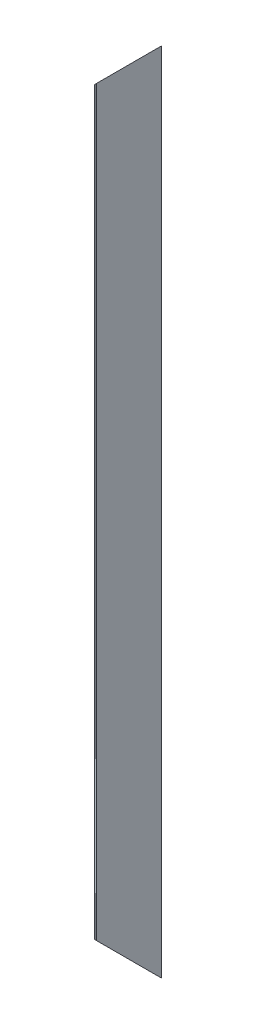
ISO-10303-21;
HEADER;
FILE_DESCRIPTION(('STEP AP214'),'2;1');
FILE_NAME('part.step','',(''),(''),'','','');
FILE_SCHEMA(('AUTOMOTIVE_DESIGN { 1 0 10303 214 1 1 1 1 }'));
ENDSEC;
DATA;
#1=APPLICATION_CONTEXT('core data for automotive mechanical design processes');
#2=APPLICATION_PROTOCOL_DEFINITION('international standard','automotive_design',2000,#1);
#3=PRODUCT_CONTEXT('',#1,'mechanical');
#4=PRODUCT('Part','Part','',(#3));
#5=PRODUCT_RELATED_PRODUCT_CATEGORY('part','',(#4));
#6=PRODUCT_DEFINITION_FORMATION('','',#4);
#7=PRODUCT_DEFINITION_CONTEXT('part definition',#1,'design');
#8=PRODUCT_DEFINITION('design','',#6,#7);
#9=PRODUCT_DEFINITION_SHAPE('','',#8);
#10=(LENGTH_UNIT() NAMED_UNIT(*) SI_UNIT(.MILLI.,.METRE.));
#11=(NAMED_UNIT(*) PLANE_ANGLE_UNIT() SI_UNIT($,.RADIAN.));
#12=(NAMED_UNIT(*) SI_UNIT($,.STERADIAN.) SOLID_ANGLE_UNIT());
#13=UNCERTAINTY_MEASURE_WITH_UNIT(LENGTH_MEASURE(1.E-05),#10,'distance_accuracy_value','');
#14=(GEOMETRIC_REPRESENTATION_CONTEXT(3) GLOBAL_UNCERTAINTY_ASSIGNED_CONTEXT((#13)) GLOBAL_UNIT_ASSIGNED_CONTEXT((#10,
#11,#12)) REPRESENTATION_CONTEXT('',''));
#15=CARTESIAN_POINT('',(0.,0.,0.));
#16=DIRECTION('',(0.,0.,1.));
#17=DIRECTION('',(1.,0.,0.));
#18=AXIS2_PLACEMENT_3D('',#15,#16,#17);
#19=CARTESIAN_POINT('',(-250.,250.,40.));
#20=DIRECTION('',(-0.707106781186547,0.707106781186548,0.));
#21=DIRECTION('',(-0.707106781186548,-0.707106781186547,0.));
#22=AXIS2_PLACEMENT_3D('',#19,#20,#21);
#23=PLANE('',#22);
#24=DIRECTION('',(0.,0.,-1.));
#25=VECTOR('',#24,1.);
#26=CARTESIAN_POINT('',(-18.5857864376268,481.414213562373,3.));
#27=LINE('',#26,#25);
#28=CARTESIAN_POINT('',(-18.5857864376268,481.414213562373,3.));
#29=VERTEX_POINT('',#28);
#30=CARTESIAN_POINT('',(-18.5857864376268,481.414213562373,0.));
#31=VERTEX_POINT('',#30);
#32=EDGE_CURVE('E13',#29,#31,#27,.T.);
#33=ORIENTED_EDGE('',*,*,#32,.F.);
#34=DIRECTION('',(0.707106781186548,0.707106781186547,0.));
#35=VECTOR('',#34,1.);
#36=CARTESIAN_POINT('',(-4.5,495.5,3.));
#37=LINE('',#36,#35);
#38=CARTESIAN_POINT('',(-9.,491.,3.));
#39=VERTEX_POINT('',#38);
#40=EDGE_CURVE('E169',#29,#39,#37,.T.);
#41=ORIENTED_EDGE('',*,*,#40,.T.);
#42=CARTESIAN_POINT('',(-9.,491.,9.));
#43=DIRECTION('',(-0.707106781186547,0.707106781186548,0.));
#44=DIRECTION('',(-0.707106781186548,-0.707106781186547,0.));
#45=AXIS2_PLACEMENT_3D('',#42,#43,#44);
#46=ELLIPSE('',#45,8.48528137423857,6.);
#47=CARTESIAN_POINT('',(-3.,497.,9.));
#48=VERTEX_POINT('',#47);
#49=EDGE_CURVE('E166',#39,#48,#46,.F.);
#50=ORIENTED_EDGE('',*,*,#49,.T.);
#51=DIRECTION('',(0.,0.,1.));
#52=VECTOR('',#51,1.);
#53=CARTESIAN_POINT('',(-3.,497.,37.));
#54=LINE('',#53,#52);
#55=CARTESIAN_POINT('',(-3.,497.,37.));
#56=VERTEX_POINT('',#55);
#57=EDGE_CURVE('E163',#48,#56,#54,.T.);
#58=ORIENTED_EDGE('',*,*,#57,.T.);
#59=CARTESIAN_POINT('',(0.,500.,37.));
#60=DIRECTION('',(-0.707106781186547,0.707106781186548,0.));
#61=DIRECTION('',(-0.707106781186548,-0.707106781186547,0.));
#62=AXIS2_PLACEMENT_3D('',#59,#60,#61);
#63=ELLIPSE('',#62,4.24264068711929,3.);
#64=CARTESIAN_POINT('',(0.,500.,40.));
#65=VERTEX_POINT('',#64);
#66=EDGE_CURVE('E88',#56,#65,#63,.T.);
#67=ORIENTED_EDGE('',*,*,#66,.T.);
#68=DIRECTION('',(0.,0.,-1.));
#69=VECTOR('',#68,1.);
#70=CARTESIAN_POINT('',(0.,500.,40.));
#71=LINE('',#70,#69);
#72=CARTESIAN_POINT('',(0.,500.,0.));
#73=VERTEX_POINT('',#72);
#74=EDGE_CURVE('E149',#65,#73,#71,.T.);
#75=ORIENTED_EDGE('',*,*,#74,.T.);
#76=DIRECTION('',(0.707106781186548,0.707106781186547,0.));
#77=VECTOR('',#76,1.);
#78=CARTESIAN_POINT('',(-250.,250.,0.));
#79=LINE('',#78,#77);
#80=EDGE_CURVE('E142',#31,#73,#79,.T.);
#81=ORIENTED_EDGE('',*,*,#80,.F.);
#82=EDGE_LOOP('',(#33,#41,#50,#58,#67,#75,#81));
#83=FACE_BOUND('',#82,.T.);
#84=ADVANCED_FACE('F64',(#83),#23,.T.);
#85=CARTESIAN_POINT('',(-40.,500.,0.));
#86=DIRECTION('',(0.,0.,1.));
#87=DIRECTION('',(1.,0.,0.));
#88=AXIS2_PLACEMENT_3D('',#85,#86,#87);
#89=PLANE('',#88);
#90=CARTESIAN_POINT('',(-20.,20.,0.));
#91=DIRECTION('',(0.,0.,-1.));
#92=DIRECTION('',(-1.,0.,0.));
#93=AXIS2_PLACEMENT_3D('',#90,#91,#92);
#94=CIRCLE('',#93,2.);
#95=CARTESIAN_POINT('',(-22.,20.,0.));
#96=VERTEX_POINT('',#95);
#97=EDGE_CURVE('E236',#96,#96,#94,.T.);
#98=ORIENTED_EDGE('',*,*,#97,.F.);
#99=EDGE_LOOP('',(#98));
#100=FACE_BOUND('',#99,.T.);
#101=CARTESIAN_POINT('',(-40.,460.,0.));
#102=VERTEX_POINT('',#101);
#103=CARTESIAN_POINT('',(-21.414213562373,478.585786437627,0.));
#104=VERTEX_POINT('',#103);
#105=EDGE_CURVE('E144',#102,#104,#79,.T.);
#106=ORIENTED_EDGE('',*,*,#105,.T.);
#107=CARTESIAN_POINT('',(-20.,480.,0.));
#108=DIRECTION('',(0.,0.,-1.));
#109=DIRECTION('',(-1.,0.,0.));
#110=AXIS2_PLACEMENT_3D('',#107,#108,#109);
#111=CIRCLE('',#110,2.);
#112=EDGE_CURVE('E79',#31,#104,#111,.T.);
#113=ORIENTED_EDGE('',*,*,#112,.F.);
#114=ORIENTED_EDGE('',*,*,#80,.T.);
#115=DIRECTION('',(0.,-1.,0.));
#116=VECTOR('',#115,1.);
#117=CARTESIAN_POINT('',(0.,500.,0.));
#118=LINE('',#117,#116);
#119=CARTESIAN_POINT('',(0.,0.,0.));
#120=VERTEX_POINT('',#119);
#121=EDGE_CURVE('E180',#73,#120,#118,.T.);
#122=ORIENTED_EDGE('',*,*,#121,.T.);
#123=DIRECTION('',(-1.,0.,0.));
#124=VECTOR('',#123,1.);
#125=CARTESIAN_POINT('',(-40.,0.,0.));
#126=LINE('',#125,#124);
#127=CARTESIAN_POINT('',(-40.,0.,0.));
#128=VERTEX_POINT('',#127);
#129=EDGE_CURVE('E177',#120,#128,#126,.T.);
#130=ORIENTED_EDGE('',*,*,#129,.T.);
#131=DIRECTION('',(0.,-1.,0.));
#132=VECTOR('',#131,1.);
#133=CARTESIAN_POINT('',(-40.,500.,0.));
#134=LINE('',#133,#132);
#135=EDGE_CURVE('E206',#102,#128,#134,.T.);
#136=ORIENTED_EDGE('',*,*,#135,.F.);
#137=EDGE_LOOP('',(#106,#113,#114,#122,#130,#136));
#138=FACE_BOUND('',#137,.T.);
#139=ADVANCED_FACE('F66',(#100,#138),#89,.F.);
#140=CARTESIAN_POINT('',(-37.,500.,0.));
#141=DIRECTION('',(0.,-1.,0.));
#142=DIRECTION('',(0.,0.,-1.));
#143=AXIS2_PLACEMENT_3D('',#140,#141,#142);
#144=CYLINDRICAL_SURFACE('',#143,3.);
#145=ORIENTED_EDGE('',*,*,#135,.T.);
#146=CARTESIAN_POINT('',(-37.,0.,0.));
#147=DIRECTION('',(0.,0.707106781186548,-0.707106781186548));
#148=DIRECTION('',(0.,-0.707106781186548,-0.707106781186548));
#149=AXIS2_PLACEMENT_3D('',#146,#147,#148);
#150=ELLIPSE('',#149,4.24264068711928,3.);
#151=CARTESIAN_POINT('',(-37.,3.,3.));
#152=VERTEX_POINT('',#151);
#153=EDGE_CURVE('E152',#128,#152,#150,.T.);
#154=ORIENTED_EDGE('',*,*,#153,.T.);
#155=DIRECTION('',(0.,-1.,0.));
#156=VECTOR('',#155,1.);
#157=CARTESIAN_POINT('',(-37.,500.,3.));
#158=LINE('',#157,#156);
#159=CARTESIAN_POINT('',(-37.,463.,3.));
#160=VERTEX_POINT('',#159);
#161=EDGE_CURVE('E202',#160,#152,#158,.T.);
#162=ORIENTED_EDGE('',*,*,#161,.F.);
#163=CARTESIAN_POINT('',(-37.,463.,0.));
#164=DIRECTION('',(-0.707106781186547,0.707106781186548,0.));
#165=DIRECTION('',(-0.707106781186548,-0.707106781186547,0.));
#166=AXIS2_PLACEMENT_3D('',#163,#164,#165);
#167=ELLIPSE('',#166,4.24264068711928,3.);
#168=EDGE_CURVE('E174',#102,#160,#167,.T.);
#169=ORIENTED_EDGE('',*,*,#168,.F.);
#170=EDGE_LOOP('',(#145,#154,#162,#169));
#171=FACE_BOUND('',#170,.T.);
#172=ADVANCED_FACE('F222',(#171),#144,.T.);
#173=CARTESIAN_POINT('',(-9.,500.,3.));
#174=DIRECTION('',(0.,0.,-1.));
#175=DIRECTION('',(-1.,0.,0.));
#176=AXIS2_PLACEMENT_3D('',#173,#174,#175);
#177=PLANE('',#176);
#178=CARTESIAN_POINT('',(-20.,20.,3.));
#179=DIRECTION('',(0.,0.,-1.));
#180=DIRECTION('',(-1.,0.,0.));
#181=AXIS2_PLACEMENT_3D('',#178,#179,#180);
#182=CIRCLE('',#181,2.);
#183=CARTESIAN_POINT('',(-22.,20.,3.));
#184=VERTEX_POINT('',#183);
#185=EDGE_CURVE('E146',#184,#184,#182,.T.);
#186=ORIENTED_EDGE('',*,*,#185,.T.);
#187=EDGE_LOOP('',(#186));
#188=FACE_BOUND('',#187,.T.);
#189=ORIENTED_EDGE('',*,*,#40,.F.);
#190=CARTESIAN_POINT('',(-20.,480.,3.));
#191=DIRECTION('',(0.,0.,-1.));
#192=DIRECTION('',(-1.,0.,0.));
#193=AXIS2_PLACEMENT_3D('',#190,#191,#192);
#194=CIRCLE('',#193,2.);
#195=CARTESIAN_POINT('',(-21.414213562373,478.585786437627,3.));
#196=VERTEX_POINT('',#195);
#197=EDGE_CURVE('E136',#29,#196,#194,.T.);
#198=ORIENTED_EDGE('',*,*,#197,.T.);
#199=EDGE_CURVE('E170',#160,#196,#37,.T.);
#200=ORIENTED_EDGE('',*,*,#199,.F.);
#201=ORIENTED_EDGE('',*,*,#161,.T.);
#202=DIRECTION('',(1.,0.,0.));
#203=VECTOR('',#202,1.);
#204=CARTESIAN_POINT('',(-9.,3.,3.));
#205=LINE('',#204,#203);
#206=CARTESIAN_POINT('',(-9.,3.,3.));
#207=VERTEX_POINT('',#206);
#208=EDGE_CURVE('E157',#152,#207,#205,.T.);
#209=ORIENTED_EDGE('',*,*,#208,.T.);
#210=DIRECTION('',(0.,-1.,0.));
#211=VECTOR('',#210,1.);
#212=CARTESIAN_POINT('',(-9.,500.,3.));
#213=LINE('',#212,#211);
#214=EDGE_CURVE('E198',#39,#207,#213,.T.);
#215=ORIENTED_EDGE('',*,*,#214,.F.);
#216=EDGE_LOOP('',(#189,#198,#200,#201,#209,#215));
#217=FACE_BOUND('',#216,.T.);
#218=ADVANCED_FACE('F213',(#188,#217),#177,.F.);
#219=CARTESIAN_POINT('',(-9.,500.,9.));
#220=DIRECTION('',(0.,-1.,0.));
#221=DIRECTION('',(0.,0.,-1.));
#222=AXIS2_PLACEMENT_3D('',#219,#220,#221);
#223=CYLINDRICAL_SURFACE('',#222,6.);
#224=ORIENTED_EDGE('',*,*,#214,.T.);
#225=CARTESIAN_POINT('',(-9.,9.00000000000001,9.));
#226=DIRECTION('',(0.,0.707106781186548,-0.707106781186548));
#227=DIRECTION('',(0.,-0.707106781186548,-0.707106781186548));
#228=AXIS2_PLACEMENT_3D('',#225,#226,#227);
#229=ELLIPSE('',#228,8.48528137423857,6.);
#230=CARTESIAN_POINT('',(-3.,8.99999999999995,9.00000000000001));
#231=VERTEX_POINT('',#230);
#232=EDGE_CURVE('E242',#207,#231,#229,.F.);
#233=ORIENTED_EDGE('',*,*,#232,.T.);
#234=DIRECTION('',(0.,-1.,0.));
#235=VECTOR('',#234,1.);
#236=CARTESIAN_POINT('',(-3.,500.,9.));
#237=LINE('',#236,#235);
#238=EDGE_CURVE('E194',#48,#231,#237,.T.);
#239=ORIENTED_EDGE('',*,*,#238,.F.);
#240=ORIENTED_EDGE('',*,*,#49,.F.);
#241=EDGE_LOOP('',(#224,#233,#239,#240));
#242=FACE_BOUND('',#241,.T.);
#243=ADVANCED_FACE('F249',(#242),#223,.F.);
#244=CARTESIAN_POINT('',(-3.,500.,37.));
#245=DIRECTION('',(1.,0.,0.));
#246=DIRECTION('',(0.,0.,-1.));
#247=AXIS2_PLACEMENT_3D('',#244,#245,#246);
#248=PLANE('',#247);
#249=ORIENTED_EDGE('',*,*,#238,.T.);
#250=DIRECTION('',(0.,0.707106781186548,0.707106781186548));
#251=VECTOR('',#250,1.);
#252=CARTESIAN_POINT('',(-3.,268.5,268.5));
#253=LINE('',#252,#251);
#254=CARTESIAN_POINT('',(-3.,37.,37.));
#255=VERTEX_POINT('',#254);
#256=EDGE_CURVE('E233',#231,#255,#253,.T.);
#257=ORIENTED_EDGE('',*,*,#256,.T.);
#258=DIRECTION('',(0.,-1.,0.));
#259=VECTOR('',#258,1.);
#260=CARTESIAN_POINT('',(-3.,500.,37.));
#261=LINE('',#260,#259);
#262=EDGE_CURVE('E190',#56,#255,#261,.T.);
#263=ORIENTED_EDGE('',*,*,#262,.F.);
#264=ORIENTED_EDGE('',*,*,#57,.F.);
#265=EDGE_LOOP('',(#249,#257,#263,#264));
#266=FACE_BOUND('',#265,.T.);
#267=ADVANCED_FACE('F254',(#266),#248,.F.);
#268=CARTESIAN_POINT('',(0.,500.,37.));
#269=DIRECTION('',(0.,-1.,0.));
#270=DIRECTION('',(0.,0.,-1.));
#271=AXIS2_PLACEMENT_3D('',#268,#269,#270);
#272=CYLINDRICAL_SURFACE('',#271,3.);
#273=ORIENTED_EDGE('',*,*,#262,.T.);
#274=CARTESIAN_POINT('',(0.,37.,37.));
#275=DIRECTION('',(0.,0.707106781186548,-0.707106781186548));
#276=DIRECTION('',(0.,-0.707106781186548,-0.707106781186548));
#277=AXIS2_PLACEMENT_3D('',#274,#275,#276);
#278=ELLIPSE('',#277,4.24264068711929,3.);
#279=CARTESIAN_POINT('',(0.,40.,40.));
#280=VERTEX_POINT('',#279);
#281=EDGE_CURVE('E230',#255,#280,#278,.T.);
#282=ORIENTED_EDGE('',*,*,#281,.T.);
#283=DIRECTION('',(0.,-1.,0.));
#284=VECTOR('',#283,1.);
#285=CARTESIAN_POINT('',(0.,500.,40.));
#286=LINE('',#285,#284);
#287=EDGE_CURVE('E186',#65,#280,#286,.T.);
#288=ORIENTED_EDGE('',*,*,#287,.F.);
#289=ORIENTED_EDGE('',*,*,#66,.F.);
#290=EDGE_LOOP('',(#273,#282,#288,#289));
#291=FACE_BOUND('',#290,.T.);
#292=ADVANCED_FACE('F256',(#291),#272,.T.);
#293=CARTESIAN_POINT('',(0.,500.,40.));
#294=DIRECTION('',(-1.,0.,0.));
#295=DIRECTION('',(0.,0.,1.));
#296=AXIS2_PLACEMENT_3D('',#293,#294,#295);
#297=PLANE('',#296);
#298=ORIENTED_EDGE('',*,*,#287,.T.);
#299=DIRECTION('',(0.,0.707106781186548,0.707106781186548));
#300=VECTOR('',#299,1.);
#301=CARTESIAN_POINT('',(0.,0.,0.));
#302=LINE('',#301,#300);
#303=EDGE_CURVE('E217',#120,#280,#302,.T.);
#304=ORIENTED_EDGE('',*,*,#303,.F.);
#305=ORIENTED_EDGE('',*,*,#121,.F.);
#306=ORIENTED_EDGE('',*,*,#74,.F.);
#307=EDGE_LOOP('',(#298,#304,#305,#306));
#308=FACE_BOUND('',#307,.T.);
#309=ADVANCED_FACE('F228',(#308),#297,.F.);
#310=DIRECTION('',(0.,0.,-1.));
#311=VECTOR('',#310,1.);
#312=CARTESIAN_POINT('',(-21.414213562373,478.585786437627,3.));
#313=LINE('',#312,#311);
#314=EDGE_CURVE('E73',#104,#196,#313,.F.);
#315=ORIENTED_EDGE('',*,*,#314,.F.);
#316=ORIENTED_EDGE('',*,*,#105,.F.);
#317=ORIENTED_EDGE('',*,*,#168,.T.);
#318=ORIENTED_EDGE('',*,*,#199,.T.);
#319=EDGE_LOOP('',(#315,#316,#317,#318));
#320=FACE_BOUND('',#319,.T.);
#321=ADVANCED_FACE('F219',(#320),#23,.T.);
#322=CARTESIAN_POINT('',(-40.,0.,0.));
#323=DIRECTION('',(0.,0.707106781186548,-0.707106781186548));
#324=DIRECTION('',(0.,0.707106781186548,0.707106781186548));
#325=AXIS2_PLACEMENT_3D('',#322,#323,#324);
#326=PLANE('',#325);
#327=ORIENTED_EDGE('',*,*,#129,.F.);
#328=ORIENTED_EDGE('',*,*,#303,.T.);
#329=ORIENTED_EDGE('',*,*,#281,.F.);
#330=ORIENTED_EDGE('',*,*,#256,.F.);
#331=ORIENTED_EDGE('',*,*,#232,.F.);
#332=ORIENTED_EDGE('',*,*,#208,.F.);
#333=ORIENTED_EDGE('',*,*,#153,.F.);
#334=EDGE_LOOP('',(#327,#328,#329,#330,#331,#332,#333));
#335=FACE_BOUND('',#334,.T.);
#336=ADVANCED_FACE('F225',(#335),#326,.F.);
#337=CARTESIAN_POINT('',(-20.,480.,3.));
#338=DIRECTION('',(0.,0.,-1.));
#339=DIRECTION('',(-1.,0.,0.));
#340=AXIS2_PLACEMENT_3D('',#337,#338,#339);
#341=CYLINDRICAL_SURFACE('',#340,2.);
#342=ORIENTED_EDGE('',*,*,#32,.T.);
#343=ORIENTED_EDGE('',*,*,#112,.T.);
#344=ORIENTED_EDGE('',*,*,#314,.T.);
#345=ORIENTED_EDGE('',*,*,#197,.F.);
#346=EDGE_LOOP('',(#342,#343,#344,#345));
#347=FACE_BOUND('',#346,.T.);
#348=ADVANCED_FACE('F134',(#347),#341,.F.);
#349=CARTESIAN_POINT('',(-20.,20.,3.));
#350=DIRECTION('',(0.,0.,-1.));
#351=DIRECTION('',(-1.,0.,0.));
#352=AXIS2_PLACEMENT_3D('',#349,#350,#351);
#353=CYLINDRICAL_SURFACE('',#352,2.);
#354=ORIENTED_EDGE('',*,*,#185,.F.);
#355=EDGE_LOOP('',(#354));
#356=FACE_BOUND('',#355,.T.);
#357=ORIENTED_EDGE('',*,*,#97,.T.);
#358=EDGE_LOOP('',(#357));
#359=FACE_BOUND('',#358,.T.);
#360=ADVANCED_FACE('F282',(#356,#359),#353,.F.);
#361=CLOSED_SHELL('',(#84,#139,#172,#218,#243,#267,#292,#309,#321,#336,#348,#360));
#362=MANIFOLD_SOLID_BREP('B2',#361);
#363=ADVANCED_BREP_SHAPE_REPRESENTATION('',(#18,#362),#14);
#364=SHAPE_DEFINITION_REPRESENTATION(#9,#363);
ENDSEC;
END-ISO-10303-21;
